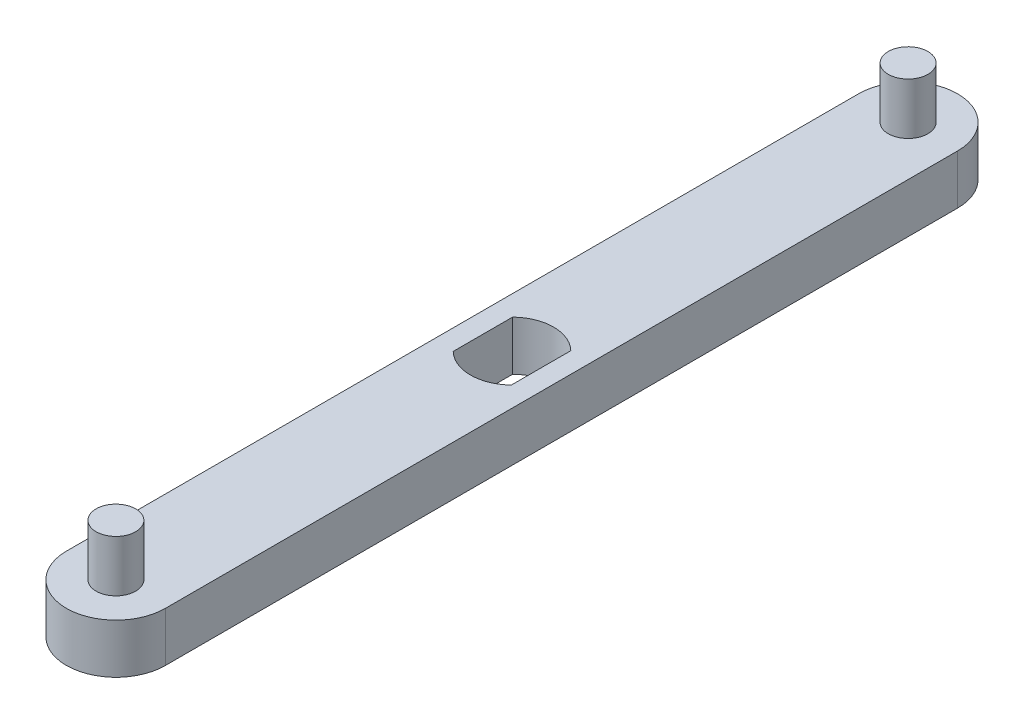
ISO-10303-21;
HEADER;
FILE_DESCRIPTION(('STEP AP214'),'2;1');
FILE_NAME('part.step','',(''),(''),'','','');
FILE_SCHEMA(('AUTOMOTIVE_DESIGN { 1 0 10303 214 1 1 1 1 }'));
ENDSEC;
DATA;
#1=APPLICATION_CONTEXT('core data for automotive mechanical design processes');
#2=APPLICATION_PROTOCOL_DEFINITION('international standard','automotive_design',2000,#1);
#3=PRODUCT_CONTEXT('',#1,'mechanical');
#4=PRODUCT('Part','Part','',(#3));
#5=PRODUCT_RELATED_PRODUCT_CATEGORY('part','',(#4));
#6=PRODUCT_DEFINITION_FORMATION('','',#4);
#7=PRODUCT_DEFINITION_CONTEXT('part definition',#1,'design');
#8=PRODUCT_DEFINITION('design','',#6,#7);
#9=PRODUCT_DEFINITION_SHAPE('','',#8);
#10=(LENGTH_UNIT() NAMED_UNIT(*) SI_UNIT(.MILLI.,.METRE.));
#11=(NAMED_UNIT(*) PLANE_ANGLE_UNIT() SI_UNIT($,.RADIAN.));
#12=(NAMED_UNIT(*) SI_UNIT($,.STERADIAN.) SOLID_ANGLE_UNIT());
#13=UNCERTAINTY_MEASURE_WITH_UNIT(LENGTH_MEASURE(1.E-05),#10,'distance_accuracy_value','');
#14=(GEOMETRIC_REPRESENTATION_CONTEXT(3) GLOBAL_UNCERTAINTY_ASSIGNED_CONTEXT((#13)) GLOBAL_UNIT_ASSIGNED_CONTEXT((#10,
#11,#12)) REPRESENTATION_CONTEXT('',''));
#15=CARTESIAN_POINT('',(0.,0.,0.));
#16=DIRECTION('',(0.,0.,1.));
#17=DIRECTION('',(1.,0.,0.));
#18=AXIS2_PLACEMENT_3D('',#15,#16,#17);
#19=CARTESIAN_POINT('',(0.,3.175,-25.4));
#20=DIRECTION('',(0.,-1.,0.));
#21=DIRECTION('',(0.,0.,-1.));
#22=AXIS2_PLACEMENT_3D('',#19,#20,#21);
#23=CYLINDRICAL_SURFACE('',#22,3.17500000000001);
#24=CARTESIAN_POINT('',(0.,0.,-25.4));
#25=DIRECTION('',(0.,1.,0.));
#26=DIRECTION('',(0.,0.,1.));
#27=AXIS2_PLACEMENT_3D('',#24,#25,#26);
#28=CIRCLE('',#27,3.17500000000001);
#29=CARTESIAN_POINT('',(3.17499999999999,0.,-25.4));
#30=VERTEX_POINT('',#29);
#31=CARTESIAN_POINT('',(-3.17500000000002,0.,-25.4));
#32=VERTEX_POINT('',#31);
#33=EDGE_CURVE('E144',#30,#32,#28,.T.);
#34=ORIENTED_EDGE('',*,*,#33,.T.);
#35=DIRECTION('',(0.,-1.,0.));
#36=VECTOR('',#35,1.);
#37=CARTESIAN_POINT('',(-3.17500000000002,3.175,-25.4));
#38=LINE('',#37,#36);
#39=CARTESIAN_POINT('',(-3.17500000000002,3.175,-25.4));
#40=VERTEX_POINT('',#39);
#41=EDGE_CURVE('E11',#40,#32,#38,.T.);
#42=ORIENTED_EDGE('',*,*,#41,.F.);
#43=CARTESIAN_POINT('',(0.,3.175,-25.4));
#44=DIRECTION('',(0.,1.,0.));
#45=DIRECTION('',(0.,0.,1.));
#46=AXIS2_PLACEMENT_3D('',#43,#44,#45);
#47=CIRCLE('',#46,3.17500000000001);
#48=CARTESIAN_POINT('',(3.17499999999999,3.175,-25.4));
#49=VERTEX_POINT('',#48);
#50=EDGE_CURVE('E147',#49,#40,#47,.T.);
#51=ORIENTED_EDGE('',*,*,#50,.F.);
#52=DIRECTION('',(0.,-1.,0.));
#53=VECTOR('',#52,1.);
#54=CARTESIAN_POINT('',(3.17499999999999,3.175,-25.4));
#55=LINE('',#54,#53);
#56=EDGE_CURVE('E157',#49,#30,#55,.T.);
#57=ORIENTED_EDGE('',*,*,#56,.T.);
#58=EDGE_LOOP('',(#34,#42,#51,#57));
#59=FACE_BOUND('',#58,.T.);
#60=ADVANCED_FACE('F35',(#59),#23,.T.);
#61=CARTESIAN_POINT('',(-3.17500000000002,3.175,-25.4));
#62=DIRECTION('',(1.,0.,0.));
#63=DIRECTION('',(0.,0.,-1.));
#64=AXIS2_PLACEMENT_3D('',#61,#62,#63);
#65=PLANE('',#64);
#66=DIRECTION('',(0.,0.,1.));
#67=VECTOR('',#66,1.);
#68=CARTESIAN_POINT('',(-3.17500000000002,0.,-25.4));
#69=LINE('',#68,#67);
#70=CARTESIAN_POINT('',(-3.17500000000001,0.,25.4));
#71=VERTEX_POINT('',#70);
#72=EDGE_CURVE('E160',#32,#71,#69,.T.);
#73=ORIENTED_EDGE('',*,*,#72,.T.);
#74=DIRECTION('',(0.,-1.,0.));
#75=VECTOR('',#74,1.);
#76=CARTESIAN_POINT('',(-3.17500000000001,3.175,25.4));
#77=LINE('',#76,#75);
#78=CARTESIAN_POINT('',(-3.17500000000001,3.175,25.4));
#79=VERTEX_POINT('',#78);
#80=EDGE_CURVE('E42',#79,#71,#77,.T.);
#81=ORIENTED_EDGE('',*,*,#80,.F.);
#82=DIRECTION('',(0.,0.,1.));
#83=VECTOR('',#82,1.);
#84=CARTESIAN_POINT('',(-3.17500000000002,3.175,-25.4));
#85=LINE('',#84,#83);
#86=EDGE_CURVE('E150',#40,#79,#85,.T.);
#87=ORIENTED_EDGE('',*,*,#86,.F.);
#88=ORIENTED_EDGE('',*,*,#41,.T.);
#89=EDGE_LOOP('',(#73,#81,#87,#88));
#90=FACE_BOUND('',#89,.T.);
#91=ADVANCED_FACE('F188',(#90),#65,.F.);
#92=CARTESIAN_POINT('',(0.,3.175,25.4));
#93=DIRECTION('',(0.,-1.,0.));
#94=DIRECTION('',(0.,0.,-1.));
#95=AXIS2_PLACEMENT_3D('',#92,#93,#94);
#96=CYLINDRICAL_SURFACE('',#95,3.17500000000001);
#97=CARTESIAN_POINT('',(0.,0.,25.4));
#98=DIRECTION('',(0.,1.,0.));
#99=DIRECTION('',(0.,0.,1.));
#100=AXIS2_PLACEMENT_3D('',#97,#98,#99);
#101=CIRCLE('',#100,3.17500000000001);
#102=CARTESIAN_POINT('',(3.17500000000002,0.,25.4));
#103=VERTEX_POINT('',#102);
#104=EDGE_CURVE('E162',#71,#103,#101,.T.);
#105=ORIENTED_EDGE('',*,*,#104,.T.);
#106=DIRECTION('',(0.,-1.,0.));
#107=VECTOR('',#106,1.);
#108=CARTESIAN_POINT('',(3.17500000000002,3.175,25.4));
#109=LINE('',#108,#107);
#110=CARTESIAN_POINT('',(3.17500000000002,3.175,25.4));
#111=VERTEX_POINT('',#110);
#112=EDGE_CURVE('E167',#111,#103,#109,.T.);
#113=ORIENTED_EDGE('',*,*,#112,.F.);
#114=CARTESIAN_POINT('',(0.,3.175,25.4));
#115=DIRECTION('',(0.,1.,0.));
#116=DIRECTION('',(0.,0.,1.));
#117=AXIS2_PLACEMENT_3D('',#114,#115,#116);
#118=CIRCLE('',#117,3.17500000000001);
#119=EDGE_CURVE('E153',#79,#111,#118,.T.);
#120=ORIENTED_EDGE('',*,*,#119,.F.);
#121=ORIENTED_EDGE('',*,*,#80,.T.);
#122=EDGE_LOOP('',(#105,#113,#120,#121));
#123=FACE_BOUND('',#122,.T.);
#124=ADVANCED_FACE('F174',(#123),#96,.T.);
#125=CARTESIAN_POINT('',(3.17500000000001,3.175,25.4));
#126=DIRECTION('',(-1.,0.,0.));
#127=DIRECTION('',(0.,0.,1.));
#128=AXIS2_PLACEMENT_3D('',#125,#126,#127);
#129=PLANE('',#128);
#130=DIRECTION('',(0.,0.,-1.));
#131=VECTOR('',#130,1.);
#132=CARTESIAN_POINT('',(3.17500000000001,0.,25.4));
#133=LINE('',#132,#131);
#134=EDGE_CURVE('E151',#103,#30,#133,.T.);
#135=ORIENTED_EDGE('',*,*,#134,.T.);
#136=ORIENTED_EDGE('',*,*,#56,.F.);
#137=DIRECTION('',(0.,0.,-1.));
#138=VECTOR('',#137,1.);
#139=CARTESIAN_POINT('',(3.17500000000001,3.175,25.4));
#140=LINE('',#139,#138);
#141=EDGE_CURVE('E155',#111,#49,#140,.T.);
#142=ORIENTED_EDGE('',*,*,#141,.F.);
#143=ORIENTED_EDGE('',*,*,#112,.T.);
#144=EDGE_LOOP('',(#135,#136,#142,#143));
#145=FACE_BOUND('',#144,.T.);
#146=ADVANCED_FACE('F181',(#145),#129,.F.);
#147=CARTESIAN_POINT('',(0.,3.175,-25.4));
#148=DIRECTION('',(0.,1.,0.));
#149=DIRECTION('',(0.,0.,1.));
#150=AXIS2_PLACEMENT_3D('',#147,#148,#149);
#151=PLANE('',#150);
#152=CARTESIAN_POINT('',(0.,3.175,0.));
#153=DIRECTION('',(0.,1.,0.));
#154=DIRECTION('',(0.,0.,1.));
#155=AXIS2_PLACEMENT_3D('',#152,#153,#154);
#156=CIRCLE('',#155,2.667);
#157=CARTESIAN_POINT('',(-1.86651118400078,3.175,1.905));
#158=VERTEX_POINT('',#157);
#159=CARTESIAN_POINT('',(1.86651118400078,3.175,1.905));
#160=VERTEX_POINT('',#159);
#161=EDGE_CURVE('E132',#158,#160,#156,.T.);
#162=ORIENTED_EDGE('',*,*,#161,.F.);
#163=DIRECTION('',(0.,0.,1.));
#164=VECTOR('',#163,1.);
#165=CARTESIAN_POINT('',(-1.86651118400078,3.175,-25.4));
#166=LINE('',#165,#164);
#167=CARTESIAN_POINT('',(-1.86651118400078,3.175,-1.905));
#168=VERTEX_POINT('',#167);
#169=EDGE_CURVE('E125',#168,#158,#166,.T.);
#170=ORIENTED_EDGE('',*,*,#169,.F.);
#171=CARTESIAN_POINT('',(0.,3.175,0.));
#172=DIRECTION('',(0.,1.,0.));
#173=DIRECTION('',(0.,0.,1.));
#174=AXIS2_PLACEMENT_3D('',#171,#172,#173);
#175=CIRCLE('',#174,2.667);
#176=CARTESIAN_POINT('',(1.86651118400078,3.175,-1.905));
#177=VERTEX_POINT('',#176);
#178=EDGE_CURVE('E105',#177,#168,#175,.T.);
#179=ORIENTED_EDGE('',*,*,#178,.F.);
#180=DIRECTION('',(0.,0.,-1.));
#181=VECTOR('',#180,1.);
#182=CARTESIAN_POINT('',(1.86651118400078,3.175,-25.4));
#183=LINE('',#182,#181);
#184=EDGE_CURVE('E130',#160,#177,#183,.T.);
#185=ORIENTED_EDGE('',*,*,#184,.F.);
#186=EDGE_LOOP('',(#162,#170,#179,#185));
#187=FACE_BOUND('',#186,.T.);
#188=CARTESIAN_POINT('',(0.,3.175,25.4));
#189=DIRECTION('',(0.,1.,0.));
#190=DIRECTION('',(0.,0.,1.));
#191=AXIS2_PLACEMENT_3D('',#188,#189,#190);
#192=CIRCLE('',#191,1.27);
#193=CARTESIAN_POINT('',(0.,3.175,24.13));
#194=VERTEX_POINT('',#193);
#195=EDGE_CURVE('E134',#194,#194,#192,.T.);
#196=ORIENTED_EDGE('',*,*,#195,.F.);
#197=EDGE_LOOP('',(#196));
#198=FACE_BOUND('',#197,.T.);
#199=CARTESIAN_POINT('',(0.,3.175,-25.4));
#200=DIRECTION('',(0.,1.,0.));
#201=DIRECTION('',(0.,0.,1.));
#202=AXIS2_PLACEMENT_3D('',#199,#200,#201);
#203=CIRCLE('',#202,1.27);
#204=CARTESIAN_POINT('',(0.,3.175,-26.67));
#205=VERTEX_POINT('',#204);
#206=EDGE_CURVE('E138',#205,#205,#203,.T.);
#207=ORIENTED_EDGE('',*,*,#206,.F.);
#208=EDGE_LOOP('',(#207));
#209=FACE_BOUND('',#208,.T.);
#210=ORIENTED_EDGE('',*,*,#50,.T.);
#211=ORIENTED_EDGE('',*,*,#86,.T.);
#212=ORIENTED_EDGE('',*,*,#119,.T.);
#213=ORIENTED_EDGE('',*,*,#141,.T.);
#214=EDGE_LOOP('',(#210,#211,#212,#213));
#215=FACE_BOUND('',#214,.T.);
#216=ADVANCED_FACE('F187',(#187,#198,#209,#215),#151,.T.);
#217=CARTESIAN_POINT('',(0.,0.,-25.4));
#218=DIRECTION('',(0.,1.,0.));
#219=DIRECTION('',(0.,0.,1.));
#220=AXIS2_PLACEMENT_3D('',#217,#218,#219);
#221=PLANE('',#220);
#222=DIRECTION('',(0.,0.,-1.));
#223=VECTOR('',#222,1.);
#224=CARTESIAN_POINT('',(-1.86651118400078,0.,1.905));
#225=LINE('',#224,#223);
#226=CARTESIAN_POINT('',(-1.86651118400078,0.,1.905));
#227=VERTEX_POINT('',#226);
#228=CARTESIAN_POINT('',(-1.86651118400078,0.,-1.905));
#229=VERTEX_POINT('',#228);
#230=EDGE_CURVE('E111',#227,#229,#225,.T.);
#231=ORIENTED_EDGE('',*,*,#230,.F.);
#232=CARTESIAN_POINT('',(0.,0.,0.));
#233=DIRECTION('',(0.,-1.,0.));
#234=DIRECTION('',(0.,0.,-1.));
#235=AXIS2_PLACEMENT_3D('',#232,#233,#234);
#236=CIRCLE('',#235,2.667);
#237=CARTESIAN_POINT('',(1.86651118400078,0.,1.905));
#238=VERTEX_POINT('',#237);
#239=EDGE_CURVE('E57',#238,#227,#236,.T.);
#240=ORIENTED_EDGE('',*,*,#239,.F.);
#241=DIRECTION('',(0.,0.,1.));
#242=VECTOR('',#241,1.);
#243=CARTESIAN_POINT('',(1.86651118400078,0.,1.905));
#244=LINE('',#243,#242);
#245=CARTESIAN_POINT('',(1.86651118400078,0.,-1.905));
#246=VERTEX_POINT('',#245);
#247=EDGE_CURVE('E118',#246,#238,#244,.T.);
#248=ORIENTED_EDGE('',*,*,#247,.F.);
#249=CARTESIAN_POINT('',(0.,0.,0.));
#250=DIRECTION('',(0.,-1.,0.));
#251=DIRECTION('',(0.,0.,-1.));
#252=AXIS2_PLACEMENT_3D('',#249,#250,#251);
#253=CIRCLE('',#252,2.667);
#254=EDGE_CURVE('E102',#229,#246,#253,.T.);
#255=ORIENTED_EDGE('',*,*,#254,.F.);
#256=EDGE_LOOP('',(#231,#240,#248,#255));
#257=FACE_BOUND('',#256,.T.);
#258=ORIENTED_EDGE('',*,*,#33,.F.);
#259=ORIENTED_EDGE('',*,*,#134,.F.);
#260=ORIENTED_EDGE('',*,*,#104,.F.);
#261=ORIENTED_EDGE('',*,*,#72,.F.);
#262=EDGE_LOOP('',(#258,#259,#260,#261));
#263=FACE_BOUND('',#262,.T.);
#264=ADVANCED_FACE('F115',(#257,#263),#221,.F.);
#265=CARTESIAN_POINT('',(0.,6.477,-25.4));
#266=DIRECTION('',(0.,-1.,0.));
#267=DIRECTION('',(0.,0.,-1.));
#268=AXIS2_PLACEMENT_3D('',#265,#266,#267);
#269=CYLINDRICAL_SURFACE('',#268,1.27);
#270=CARTESIAN_POINT('',(0.,6.477,-25.4));
#271=DIRECTION('',(0.,1.,0.));
#272=DIRECTION('',(0.,0.,1.));
#273=AXIS2_PLACEMENT_3D('',#270,#271,#272);
#274=CIRCLE('',#273,1.27);
#275=CARTESIAN_POINT('',(0.,6.477,-26.67));
#276=VERTEX_POINT('',#275);
#277=EDGE_CURVE('E141',#276,#276,#274,.T.);
#278=CARTESIAN_POINT('',(0.,6.477,-26.67));
#279=CARTESIAN_POINT('',(0.,6.44260416666667,-26.67));
#280=CARTESIAN_POINT('',(0.,6.40820833333333,-26.67));
#281=CARTESIAN_POINT('',(0.,6.33941666666667,-26.67));
#282=CARTESIAN_POINT('',(0.,6.30502083333333,-26.67));
#283=CARTESIAN_POINT('',(0.,6.23622916666667,-26.67));
#284=CARTESIAN_POINT('',(0.,6.20183333333333,-26.67));
#285=CARTESIAN_POINT('',(0.,6.13304166666667,-26.67));
#286=CARTESIAN_POINT('',(0.,6.09864583333333,-26.67));
#287=CARTESIAN_POINT('',(0.,6.02985416666667,-26.67));
#288=CARTESIAN_POINT('',(0.,5.99545833333333,-26.67));
#289=CARTESIAN_POINT('',(0.,5.92666666666667,-26.67));
#290=CARTESIAN_POINT('',(0.,5.89227083333333,-26.67));
#291=CARTESIAN_POINT('',(0.,5.82347916666667,-26.67));
#292=CARTESIAN_POINT('',(0.,5.78908333333333,-26.67));
#293=CARTESIAN_POINT('',(0.,5.72029166666667,-26.67));
#294=CARTESIAN_POINT('',(0.,5.68589583333333,-26.67));
#295=CARTESIAN_POINT('',(0.,5.61710416666667,-26.67));
#296=CARTESIAN_POINT('',(0.,5.58270833333333,-26.67));
#297=CARTESIAN_POINT('',(0.,5.51391666666667,-26.67));
#298=CARTESIAN_POINT('',(0.,5.47952083333333,-26.67));
#299=CARTESIAN_POINT('',(0.,5.41072916666667,-26.67));
#300=CARTESIAN_POINT('',(0.,5.37633333333333,-26.67));
#301=CARTESIAN_POINT('',(0.,5.30754166666667,-26.67));
#302=CARTESIAN_POINT('',(0.,5.27314583333333,-26.67));
#303=CARTESIAN_POINT('',(0.,5.20435416666667,-26.67));
#304=CARTESIAN_POINT('',(0.,5.16995833333333,-26.67));
#305=CARTESIAN_POINT('',(0.,5.10116666666667,-26.67));
#306=CARTESIAN_POINT('',(0.,5.06677083333333,-26.67));
#307=CARTESIAN_POINT('',(0.,4.99797916666667,-26.67));
#308=CARTESIAN_POINT('',(0.,4.96358333333333,-26.67));
#309=CARTESIAN_POINT('',(0.,4.89479166666667,-26.67));
#310=CARTESIAN_POINT('',(0.,4.86039583333333,-26.67));
#311=CARTESIAN_POINT('',(0.,4.79160416666667,-26.67));
#312=CARTESIAN_POINT('',(0.,4.75720833333333,-26.67));
#313=CARTESIAN_POINT('',(0.,4.68841666666667,-26.67));
#314=CARTESIAN_POINT('',(0.,4.65402083333333,-26.67));
#315=CARTESIAN_POINT('',(0.,4.58522916666667,-26.67));
#316=CARTESIAN_POINT('',(0.,4.55083333333333,-26.67));
#317=CARTESIAN_POINT('',(0.,4.48204166666667,-26.67));
#318=CARTESIAN_POINT('',(0.,4.44764583333333,-26.67));
#319=CARTESIAN_POINT('',(0.,4.37885416666667,-26.67));
#320=CARTESIAN_POINT('',(0.,4.34445833333333,-26.67));
#321=CARTESIAN_POINT('',(0.,4.27566666666667,-26.67));
#322=CARTESIAN_POINT('',(0.,4.24127083333333,-26.67));
#323=CARTESIAN_POINT('',(0.,4.17247916666667,-26.67));
#324=CARTESIAN_POINT('',(0.,4.13808333333333,-26.67));
#325=CARTESIAN_POINT('',(0.,4.06929166666667,-26.67));
#326=CARTESIAN_POINT('',(0.,4.03489583333333,-26.67));
#327=CARTESIAN_POINT('',(0.,3.96610416666667,-26.67));
#328=CARTESIAN_POINT('',(0.,3.93170833333333,-26.67));
#329=CARTESIAN_POINT('',(0.,3.86291666666667,-26.67));
#330=CARTESIAN_POINT('',(0.,3.82852083333333,-26.67));
#331=CARTESIAN_POINT('',(0.,3.75972916666667,-26.67));
#332=CARTESIAN_POINT('',(0.,3.72533333333333,-26.67));
#333=CARTESIAN_POINT('',(0.,3.65654166666667,-26.67));
#334=CARTESIAN_POINT('',(0.,3.62214583333333,-26.67));
#335=CARTESIAN_POINT('',(0.,3.55335416666667,-26.67));
#336=CARTESIAN_POINT('',(0.,3.51895833333333,-26.67));
#337=CARTESIAN_POINT('',(0.,3.45016666666667,-26.67));
#338=CARTESIAN_POINT('',(0.,3.41577083333333,-26.67));
#339=CARTESIAN_POINT('',(0.,3.34697916666667,-26.67));
#340=CARTESIAN_POINT('',(0.,3.31258333333333,-26.67));
#341=CARTESIAN_POINT('',(0.,3.24379166666667,-26.67));
#342=CARTESIAN_POINT('',(0.,3.20939583333333,-26.67));
#343=CARTESIAN_POINT('',(0.,3.175,-26.67));
#344=B_SPLINE_CURVE_WITH_KNOTS('',3,(#278,#279,#280,#281,#282,#283,#284,#285,#286,#287,#288,
#289,#290,#291,#292,#293,#294,#295,#296,#297,#298,#299,#300,#301,#302,#303,#304,#305,#306,#307,
#308,#309,#310,#311,#312,#313,#314,#315,#316,#317,#318,#319,#320,#321,#322,#323,#324,#325,#326,
#327,#328,#329,#330,#331,#332,#333,#334,#335,#336,#337,#338,#339,#340,#341,#342,#343),
.UNSPECIFIED.,.F.,.F.,(4,2,2,2,2,2,2,2,2,2,2,2,2,2,2,2,2,2,2,2,2,2,2,2,2,2,2,2,2,2,2,2,4),(0.,
0.103187500000001,0.206375000000001,0.309562500000001,0.412750000000001,0.515937500000001,
0.619125000000001,0.722312500000001,0.825500000000001,0.928687500000001,1.031875,1.1350625,
1.23825,1.3414375,1.444625,1.5478125,1.651,1.7541875,1.857375,1.9605625,2.06375,2.1669375,
2.270125,2.3733125,2.4765,2.5796875,2.682875,2.7860625,2.88925,2.9924375,3.095625,3.1988125,
3.302),.UNSPECIFIED.);
#345=EDGE_CURVE('BSEAM200',#276,#205,#344,.T.);
#346=ORIENTED_EDGE('',*,*,#277,.F.);
#347=ORIENTED_EDGE('',*,*,#206,.T.);
#348=ORIENTED_EDGE('',*,*,#345,.T.);
#349=ORIENTED_EDGE('',*,*,#345,.F.);
#350=EDGE_LOOP('',(#346,#348,#347,#349));
#351=FACE_BOUND('',#350,.T.);
#352=ADVANCED_FACE('F200',(#351),#269,.T.);
#353=CARTESIAN_POINT('',(0.,6.477,-25.4));
#354=DIRECTION('',(0.,1.,0.));
#355=DIRECTION('',(0.,0.,1.));
#356=AXIS2_PLACEMENT_3D('',#353,#354,#355);
#357=PLANE('',#356);
#358=ORIENTED_EDGE('',*,*,#277,.T.);
#359=EDGE_LOOP('',(#358));
#360=FACE_BOUND('',#359,.T.);
#361=ADVANCED_FACE('F206',(#360),#357,.T.);
#362=CARTESIAN_POINT('',(0.,6.477,25.4));
#363=DIRECTION('',(0.,-1.,0.));
#364=DIRECTION('',(0.,0.,-1.));
#365=AXIS2_PLACEMENT_3D('',#362,#363,#364);
#366=CYLINDRICAL_SURFACE('',#365,1.27);
#367=CARTESIAN_POINT('',(0.,6.477,25.4));
#368=DIRECTION('',(0.,1.,0.));
#369=DIRECTION('',(0.,0.,1.));
#370=AXIS2_PLACEMENT_3D('',#367,#368,#369);
#371=CIRCLE('',#370,1.27);
#372=CARTESIAN_POINT('',(0.,6.477,24.13));
#373=VERTEX_POINT('',#372);
#374=EDGE_CURVE('E135',#373,#373,#371,.T.);
#375=CARTESIAN_POINT('',(0.,6.477,24.13));
#376=CARTESIAN_POINT('',(0.,6.44260416666667,24.13));
#377=CARTESIAN_POINT('',(0.,6.40820833333333,24.13));
#378=CARTESIAN_POINT('',(0.,6.33941666666667,24.13));
#379=CARTESIAN_POINT('',(0.,6.30502083333333,24.13));
#380=CARTESIAN_POINT('',(0.,6.23622916666667,24.13));
#381=CARTESIAN_POINT('',(0.,6.20183333333333,24.13));
#382=CARTESIAN_POINT('',(0.,6.13304166666667,24.13));
#383=CARTESIAN_POINT('',(0.,6.09864583333333,24.13));
#384=CARTESIAN_POINT('',(0.,6.02985416666667,24.13));
#385=CARTESIAN_POINT('',(0.,5.99545833333333,24.13));
#386=CARTESIAN_POINT('',(0.,5.92666666666667,24.13));
#387=CARTESIAN_POINT('',(0.,5.89227083333333,24.13));
#388=CARTESIAN_POINT('',(0.,5.82347916666667,24.13));
#389=CARTESIAN_POINT('',(0.,5.78908333333333,24.13));
#390=CARTESIAN_POINT('',(0.,5.72029166666667,24.13));
#391=CARTESIAN_POINT('',(0.,5.68589583333333,24.13));
#392=CARTESIAN_POINT('',(0.,5.61710416666667,24.13));
#393=CARTESIAN_POINT('',(0.,5.58270833333333,24.13));
#394=CARTESIAN_POINT('',(0.,5.51391666666667,24.13));
#395=CARTESIAN_POINT('',(0.,5.47952083333333,24.13));
#396=CARTESIAN_POINT('',(0.,5.41072916666667,24.13));
#397=CARTESIAN_POINT('',(0.,5.37633333333333,24.13));
#398=CARTESIAN_POINT('',(0.,5.30754166666667,24.13));
#399=CARTESIAN_POINT('',(0.,5.27314583333333,24.13));
#400=CARTESIAN_POINT('',(0.,5.20435416666667,24.13));
#401=CARTESIAN_POINT('',(0.,5.16995833333333,24.13));
#402=CARTESIAN_POINT('',(0.,5.10116666666667,24.13));
#403=CARTESIAN_POINT('',(0.,5.06677083333333,24.13));
#404=CARTESIAN_POINT('',(0.,4.99797916666667,24.13));
#405=CARTESIAN_POINT('',(0.,4.96358333333333,24.13));
#406=CARTESIAN_POINT('',(0.,4.89479166666667,24.13));
#407=CARTESIAN_POINT('',(0.,4.86039583333333,24.13));
#408=CARTESIAN_POINT('',(0.,4.79160416666667,24.13));
#409=CARTESIAN_POINT('',(0.,4.75720833333333,24.13));
#410=CARTESIAN_POINT('',(0.,4.68841666666667,24.13));
#411=CARTESIAN_POINT('',(0.,4.65402083333333,24.13));
#412=CARTESIAN_POINT('',(0.,4.58522916666667,24.13));
#413=CARTESIAN_POINT('',(0.,4.55083333333333,24.13));
#414=CARTESIAN_POINT('',(0.,4.48204166666667,24.13));
#415=CARTESIAN_POINT('',(0.,4.44764583333333,24.13));
#416=CARTESIAN_POINT('',(0.,4.37885416666667,24.13));
#417=CARTESIAN_POINT('',(0.,4.34445833333333,24.13));
#418=CARTESIAN_POINT('',(0.,4.27566666666667,24.13));
#419=CARTESIAN_POINT('',(0.,4.24127083333333,24.13));
#420=CARTESIAN_POINT('',(0.,4.17247916666667,24.13));
#421=CARTESIAN_POINT('',(0.,4.13808333333333,24.13));
#422=CARTESIAN_POINT('',(0.,4.06929166666667,24.13));
#423=CARTESIAN_POINT('',(0.,4.03489583333333,24.13));
#424=CARTESIAN_POINT('',(0.,3.96610416666667,24.13));
#425=CARTESIAN_POINT('',(0.,3.93170833333333,24.13));
#426=CARTESIAN_POINT('',(0.,3.86291666666667,24.13));
#427=CARTESIAN_POINT('',(0.,3.82852083333333,24.13));
#428=CARTESIAN_POINT('',(0.,3.75972916666667,24.13));
#429=CARTESIAN_POINT('',(0.,3.72533333333333,24.13));
#430=CARTESIAN_POINT('',(0.,3.65654166666667,24.13));
#431=CARTESIAN_POINT('',(0.,3.62214583333333,24.13));
#432=CARTESIAN_POINT('',(0.,3.55335416666667,24.13));
#433=CARTESIAN_POINT('',(0.,3.51895833333333,24.13));
#434=CARTESIAN_POINT('',(0.,3.45016666666667,24.13));
#435=CARTESIAN_POINT('',(0.,3.41577083333333,24.13));
#436=CARTESIAN_POINT('',(0.,3.34697916666667,24.13));
#437=CARTESIAN_POINT('',(0.,3.31258333333333,24.13));
#438=CARTESIAN_POINT('',(0.,3.24379166666667,24.13));
#439=CARTESIAN_POINT('',(0.,3.20939583333333,24.13));
#440=CARTESIAN_POINT('',(0.,3.175,24.13));
#441=B_SPLINE_CURVE_WITH_KNOTS('',3,(#375,#376,#377,#378,#379,#380,#381,#382,#383,#384,#385,
#386,#387,#388,#389,#390,#391,#392,#393,#394,#395,#396,#397,#398,#399,#400,#401,#402,#403,#404,
#405,#406,#407,#408,#409,#410,#411,#412,#413,#414,#415,#416,#417,#418,#419,#420,#421,#422,#423,
#424,#425,#426,#427,#428,#429,#430,#431,#432,#433,#434,#435,#436,#437,#438,#439,#440),
.UNSPECIFIED.,.F.,.F.,(4,2,2,2,2,2,2,2,2,2,2,2,2,2,2,2,2,2,2,2,2,2,2,2,2,2,2,2,2,2,2,2,4),(0.,
0.103187500000001,0.206375000000001,0.309562500000001,0.412750000000001,0.515937500000001,
0.619125000000001,0.722312500000001,0.825500000000001,0.928687500000001,1.031875,1.1350625,
1.23825,1.3414375,1.444625,1.5478125,1.651,1.7541875,1.857375,1.9605625,2.06375,2.1669375,
2.270125,2.3733125,2.4765,2.5796875,2.682875,2.7860625,2.88925,2.9924375,3.095625,3.1988125,
3.302),.UNSPECIFIED.);
#442=EDGE_CURVE('BSEAM210',#373,#194,#441,.T.);
#443=ORIENTED_EDGE('',*,*,#374,.F.);
#444=ORIENTED_EDGE('',*,*,#195,.T.);
#445=ORIENTED_EDGE('',*,*,#442,.T.);
#446=ORIENTED_EDGE('',*,*,#442,.F.);
#447=EDGE_LOOP('',(#443,#445,#444,#446));
#448=FACE_BOUND('',#447,.T.);
#449=ADVANCED_FACE('F210',(#448),#366,.T.);
#450=CARTESIAN_POINT('',(0.,6.477,25.4));
#451=DIRECTION('',(0.,1.,0.));
#452=DIRECTION('',(0.,0.,1.));
#453=AXIS2_PLACEMENT_3D('',#450,#451,#452);
#454=PLANE('',#453);
#455=ORIENTED_EDGE('',*,*,#374,.T.);
#456=EDGE_LOOP('',(#455));
#457=FACE_BOUND('',#456,.T.);
#458=ADVANCED_FACE('F214',(#457),#454,.T.);
#459=CARTESIAN_POINT('',(0.,6.477,0.));
#460=DIRECTION('',(0.,-1.,0.));
#461=DIRECTION('',(0.,0.,-1.));
#462=AXIS2_PLACEMENT_3D('',#459,#460,#461);
#463=CYLINDRICAL_SURFACE('',#462,2.667);
#464=ORIENTED_EDGE('',*,*,#161,.T.);
#465=DIRECTION('',(0.,-1.,0.));
#466=VECTOR('',#465,1.);
#467=CARTESIAN_POINT('',(1.86651118400078,6.477,1.905));
#468=LINE('',#467,#466);
#469=EDGE_CURVE('E123',#160,#238,#468,.T.);
#470=ORIENTED_EDGE('',*,*,#469,.T.);
#471=ORIENTED_EDGE('',*,*,#239,.T.);
#472=DIRECTION('',(0.,-1.,0.));
#473=VECTOR('',#472,1.);
#474=CARTESIAN_POINT('',(-1.86651118400078,6.477,1.905));
#475=LINE('',#474,#473);
#476=EDGE_CURVE('E108',#158,#227,#475,.T.);
#477=ORIENTED_EDGE('',*,*,#476,.F.);
#478=EDGE_LOOP('',(#464,#470,#471,#477));
#479=FACE_BOUND('',#478,.T.);
#480=ADVANCED_FACE('F218',(#479),#463,.F.);
#481=CARTESIAN_POINT('',(1.86651118400078,6.477,1.905));
#482=DIRECTION('',(1.,0.,0.));
#483=DIRECTION('',(0.,0.,-1.));
#484=AXIS2_PLACEMENT_3D('',#481,#482,#483);
#485=PLANE('',#484);
#486=ORIENTED_EDGE('',*,*,#184,.T.);
#487=DIRECTION('',(0.,-1.,0.));
#488=VECTOR('',#487,1.);
#489=CARTESIAN_POINT('',(1.86651118400078,6.477,-1.905));
#490=LINE('',#489,#488);
#491=EDGE_CURVE('E107',#177,#246,#490,.T.);
#492=ORIENTED_EDGE('',*,*,#491,.T.);
#493=ORIENTED_EDGE('',*,*,#247,.T.);
#494=ORIENTED_EDGE('',*,*,#469,.F.);
#495=EDGE_LOOP('',(#486,#492,#493,#494));
#496=FACE_BOUND('',#495,.T.);
#497=ADVANCED_FACE('F222',(#496),#485,.F.);
#498=CARTESIAN_POINT('',(0.,6.477,0.));
#499=DIRECTION('',(0.,-1.,0.));
#500=DIRECTION('',(0.,0.,-1.));
#501=AXIS2_PLACEMENT_3D('',#498,#499,#500);
#502=CYLINDRICAL_SURFACE('',#501,2.667);
#503=ORIENTED_EDGE('',*,*,#178,.T.);
#504=DIRECTION('',(0.,-1.,0.));
#505=VECTOR('',#504,1.);
#506=CARTESIAN_POINT('',(-1.86651118400078,6.477,-1.905));
#507=LINE('',#506,#505);
#508=EDGE_CURVE('E49',#168,#229,#507,.T.);
#509=ORIENTED_EDGE('',*,*,#508,.T.);
#510=ORIENTED_EDGE('',*,*,#254,.T.);
#511=ORIENTED_EDGE('',*,*,#491,.F.);
#512=EDGE_LOOP('',(#503,#509,#510,#511));
#513=FACE_BOUND('',#512,.T.);
#514=ADVANCED_FACE('F99',(#513),#502,.F.);
#515=CARTESIAN_POINT('',(-1.86651118400078,6.477,1.905));
#516=DIRECTION('',(-1.,0.,0.));
#517=DIRECTION('',(0.,0.,1.));
#518=AXIS2_PLACEMENT_3D('',#515,#516,#517);
#519=PLANE('',#518);
#520=ORIENTED_EDGE('',*,*,#169,.T.);
#521=ORIENTED_EDGE('',*,*,#476,.T.);
#522=ORIENTED_EDGE('',*,*,#230,.T.);
#523=ORIENTED_EDGE('',*,*,#508,.F.);
#524=EDGE_LOOP('',(#520,#521,#522,#523));
#525=FACE_BOUND('',#524,.T.);
#526=ADVANCED_FACE('F112',(#525),#519,.F.);
#527=CLOSED_SHELL('',(#60,#91,#124,#146,#216,#264,#352,#361,#449,#458,#480,#497,#514,#526));
#528=MANIFOLD_SOLID_BREP('B2',#527);
#529=ADVANCED_BREP_SHAPE_REPRESENTATION('',(#18,#528),#14);
#530=SHAPE_DEFINITION_REPRESENTATION(#9,#529);
ENDSEC;
END-ISO-10303-21;
